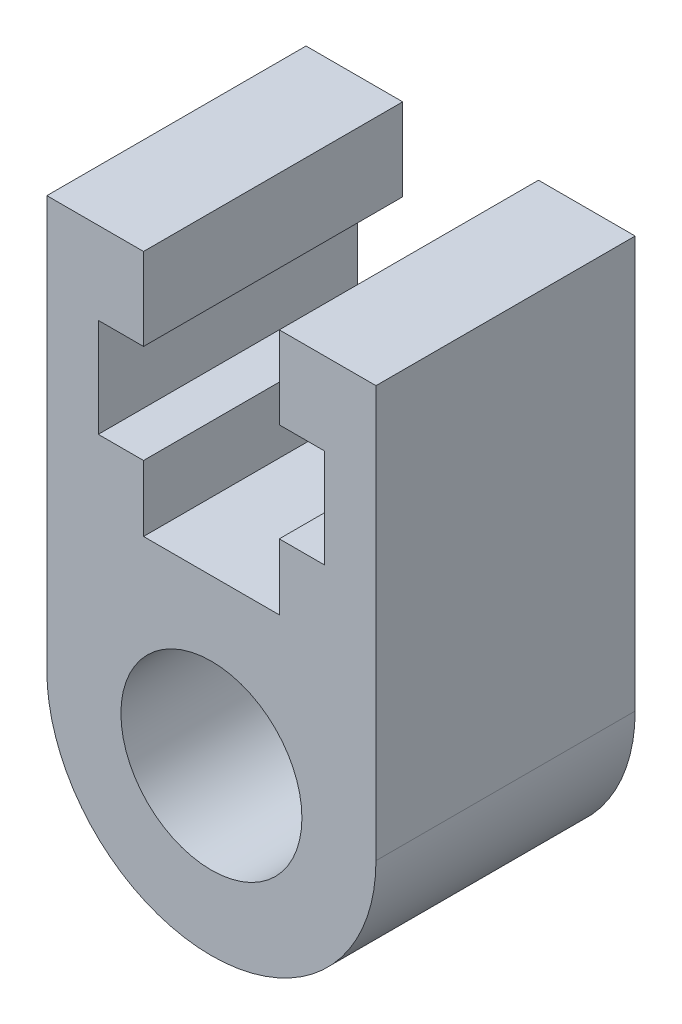
ISO-10303-21;
HEADER;
FILE_DESCRIPTION(('STEP AP214'),'2;1');
FILE_NAME('part.step','',(''),(''),'','','');
FILE_SCHEMA(('AUTOMOTIVE_DESIGN { 1 0 10303 214 1 1 1 1 }'));
ENDSEC;
DATA;
#1=APPLICATION_CONTEXT('core data for automotive mechanical design processes');
#2=APPLICATION_PROTOCOL_DEFINITION('international standard','automotive_design',2000,#1);
#3=PRODUCT_CONTEXT('',#1,'mechanical');
#4=PRODUCT('Part','Part','',(#3));
#5=PRODUCT_RELATED_PRODUCT_CATEGORY('part','',(#4));
#6=PRODUCT_DEFINITION_FORMATION('','',#4);
#7=PRODUCT_DEFINITION_CONTEXT('part definition',#1,'design');
#8=PRODUCT_DEFINITION('design','',#6,#7);
#9=PRODUCT_DEFINITION_SHAPE('','',#8);
#10=(LENGTH_UNIT() NAMED_UNIT(*) SI_UNIT(.MILLI.,.METRE.));
#11=(NAMED_UNIT(*) PLANE_ANGLE_UNIT() SI_UNIT($,.RADIAN.));
#12=(NAMED_UNIT(*) SI_UNIT($,.STERADIAN.) SOLID_ANGLE_UNIT());
#13=UNCERTAINTY_MEASURE_WITH_UNIT(LENGTH_MEASURE(1.E-05),#10,'distance_accuracy_value','');
#14=(GEOMETRIC_REPRESENTATION_CONTEXT(3) GLOBAL_UNCERTAINTY_ASSIGNED_CONTEXT((#13)) GLOBAL_UNIT_ASSIGNED_CONTEXT((#10,
#11,#12)) REPRESENTATION_CONTEXT('',''));
#15=CARTESIAN_POINT('',(0.,0.,0.));
#16=DIRECTION('',(0.,0.,1.));
#17=DIRECTION('',(1.,0.,0.));
#18=AXIS2_PLACEMENT_3D('',#15,#16,#17);
#19=CARTESIAN_POINT('',(0.,0.,6.3));
#20=DIRECTION('',(0.,0.,1.));
#21=DIRECTION('',(1.,0.,0.));
#22=AXIS2_PLACEMENT_3D('',#19,#20,#21);
#23=PLANE('',#22);
#24=CARTESIAN_POINT('',(0.,0.,6.3));
#25=DIRECTION('',(0.,0.,1.));
#26=DIRECTION('',(1.,0.,0.));
#27=AXIS2_PLACEMENT_3D('',#24,#25,#26);
#28=CIRCLE('',#27,4.);
#29=CARTESIAN_POINT('',(-4.,0.,6.3));
#30=VERTEX_POINT('',#29);
#31=CARTESIAN_POINT('',(4.,0.,6.3));
#32=VERTEX_POINT('',#31);
#33=EDGE_CURVE('E236',#30,#32,#28,.T.);
#34=ORIENTED_EDGE('',*,*,#33,.T.);
#35=DIRECTION('',(0.,1.,0.));
#36=VECTOR('',#35,1.);
#37=CARTESIAN_POINT('',(4.,0.,6.3));
#38=LINE('',#37,#36);
#39=CARTESIAN_POINT('',(4.,10.,6.3));
#40=VERTEX_POINT('',#39);
#41=EDGE_CURVE('E124',#32,#40,#38,.T.);
#42=ORIENTED_EDGE('',*,*,#41,.T.);
#43=DIRECTION('',(-1.,0.,0.));
#44=VECTOR('',#43,1.);
#45=CARTESIAN_POINT('',(4.,10.,6.3));
#46=LINE('',#45,#44);
#47=CARTESIAN_POINT('',(1.65,10.,6.3));
#48=VERTEX_POINT('',#47);
#49=EDGE_CURVE('E289',#40,#48,#46,.T.);
#50=ORIENTED_EDGE('',*,*,#49,.T.);
#51=DIRECTION('',(0.,-1.,0.));
#52=VECTOR('',#51,1.);
#53=CARTESIAN_POINT('',(1.65,10.,6.3));
#54=LINE('',#53,#52);
#55=CARTESIAN_POINT('',(1.65,8.,6.3));
#56=VERTEX_POINT('',#55);
#57=EDGE_CURVE('E309',#48,#56,#54,.T.);
#58=ORIENTED_EDGE('',*,*,#57,.T.);
#59=DIRECTION('',(1.,0.,0.));
#60=VECTOR('',#59,1.);
#61=CARTESIAN_POINT('',(1.65,8.,6.3));
#62=LINE('',#61,#60);
#63=CARTESIAN_POINT('',(2.75,8.,6.3));
#64=VERTEX_POINT('',#63);
#65=EDGE_CURVE('E305',#56,#64,#62,.T.);
#66=ORIENTED_EDGE('',*,*,#65,.T.);
#67=DIRECTION('',(0.,-1.,0.));
#68=VECTOR('',#67,1.);
#69=CARTESIAN_POINT('',(2.75,8.,6.3));
#70=LINE('',#69,#68);
#71=CARTESIAN_POINT('',(2.75,5.6,6.3));
#72=VERTEX_POINT('',#71);
#73=EDGE_CURVE('E308',#64,#72,#70,.T.);
#74=ORIENTED_EDGE('',*,*,#73,.T.);
#75=DIRECTION('',(-1.,0.,0.));
#76=VECTOR('',#75,1.);
#77=CARTESIAN_POINT('',(2.75,5.6,6.3));
#78=LINE('',#77,#76);
#79=CARTESIAN_POINT('',(1.65,5.6,6.3));
#80=VERTEX_POINT('',#79);
#81=EDGE_CURVE('E313',#72,#80,#78,.T.);
#82=ORIENTED_EDGE('',*,*,#81,.T.);
#83=DIRECTION('',(0.,-1.,0.));
#84=VECTOR('',#83,1.);
#85=CARTESIAN_POINT('',(1.65,5.6,6.3));
#86=LINE('',#85,#84);
#87=CARTESIAN_POINT('',(1.65,4.,6.3));
#88=VERTEX_POINT('',#87);
#89=EDGE_CURVE('E320',#80,#88,#86,.T.);
#90=ORIENTED_EDGE('',*,*,#89,.T.);
#91=DIRECTION('',(-1.,0.,0.));
#92=VECTOR('',#91,1.);
#93=CARTESIAN_POINT('',(-1.65,4.,6.3));
#94=LINE('',#93,#92);
#95=CARTESIAN_POINT('',(-1.65,4.,6.3));
#96=VERTEX_POINT('',#95);
#97=EDGE_CURVE('E323',#88,#96,#94,.T.);
#98=ORIENTED_EDGE('',*,*,#97,.T.);
#99=DIRECTION('',(0.,1.,0.));
#100=VECTOR('',#99,1.);
#101=CARTESIAN_POINT('',(-1.65,5.6,6.3));
#102=LINE('',#101,#100);
#103=CARTESIAN_POINT('',(-1.65,5.6,6.3));
#104=VERTEX_POINT('',#103);
#105=EDGE_CURVE('E326',#96,#104,#102,.T.);
#106=ORIENTED_EDGE('',*,*,#105,.T.);
#107=DIRECTION('',(-1.,0.,0.));
#108=VECTOR('',#107,1.);
#109=CARTESIAN_POINT('',(-2.75,5.6,6.3));
#110=LINE('',#109,#108);
#111=CARTESIAN_POINT('',(-2.75,5.6,6.3));
#112=VERTEX_POINT('',#111);
#113=EDGE_CURVE('E329',#104,#112,#110,.T.);
#114=ORIENTED_EDGE('',*,*,#113,.T.);
#115=DIRECTION('',(0.,1.,0.));
#116=VECTOR('',#115,1.);
#117=CARTESIAN_POINT('',(-2.75,8.,6.3));
#118=LINE('',#117,#116);
#119=CARTESIAN_POINT('',(-2.75,8.,6.3));
#120=VERTEX_POINT('',#119);
#121=EDGE_CURVE('E332',#112,#120,#118,.T.);
#122=ORIENTED_EDGE('',*,*,#121,.T.);
#123=DIRECTION('',(1.,0.,0.));
#124=VECTOR('',#123,1.);
#125=CARTESIAN_POINT('',(-1.65,8.,6.3));
#126=LINE('',#125,#124);
#127=CARTESIAN_POINT('',(-1.65,8.,6.3));
#128=VERTEX_POINT('',#127);
#129=EDGE_CURVE('E167',#120,#128,#126,.T.);
#130=ORIENTED_EDGE('',*,*,#129,.T.);
#131=DIRECTION('',(0.,1.,0.));
#132=VECTOR('',#131,1.);
#133=CARTESIAN_POINT('',(-1.65,10.,6.3));
#134=LINE('',#133,#132);
#135=CARTESIAN_POINT('',(-1.65,10.,6.3));
#136=VERTEX_POINT('',#135);
#137=EDGE_CURVE('E161',#128,#136,#134,.T.);
#138=ORIENTED_EDGE('',*,*,#137,.T.);
#139=DIRECTION('',(-1.,0.,0.));
#140=VECTOR('',#139,1.);
#141=CARTESIAN_POINT('',(-4.,10.,6.3));
#142=LINE('',#141,#140);
#143=CARTESIAN_POINT('',(-4.,10.,6.3));
#144=VERTEX_POINT('',#143);
#145=EDGE_CURVE('E165',#136,#144,#142,.T.);
#146=ORIENTED_EDGE('',*,*,#145,.T.);
#147=DIRECTION('',(0.,-1.,0.));
#148=VECTOR('',#147,1.);
#149=CARTESIAN_POINT('',(-4.,0.,6.3));
#150=LINE('',#149,#148);
#151=EDGE_CURVE('E57',#144,#30,#150,.T.);
#152=ORIENTED_EDGE('',*,*,#151,.T.);
#153=EDGE_LOOP('',(#34,#42,#50,#58,#66,#74,#82,#90,#98,#106,#114,#122,#130,#138,#146,#152));
#154=FACE_BOUND('',#153,.T.);
#155=CARTESIAN_POINT('',(0.,0.,6.3));
#156=DIRECTION('',(0.,0.,1.));
#157=DIRECTION('',(1.,0.,0.));
#158=AXIS2_PLACEMENT_3D('',#155,#156,#157);
#159=CIRCLE('',#158,2.2);
#160=CARTESIAN_POINT('',(2.2,0.,6.3));
#161=VERTEX_POINT('',#160);
#162=EDGE_CURVE('E194',#161,#161,#159,.T.);
#163=ORIENTED_EDGE('',*,*,#162,.F.);
#164=EDGE_LOOP('',(#163));
#165=FACE_BOUND('',#164,.T.);
#166=ADVANCED_FACE('F39',(#154,#165),#23,.T.);
#167=CARTESIAN_POINT('',(0.,0.,0.));
#168=DIRECTION('',(0.,0.,1.));
#169=DIRECTION('',(1.,0.,0.));
#170=AXIS2_PLACEMENT_3D('',#167,#168,#169);
#171=PLANE('',#170);
#172=CARTESIAN_POINT('',(0.,0.,0.));
#173=DIRECTION('',(0.,0.,1.));
#174=DIRECTION('',(1.,0.,0.));
#175=AXIS2_PLACEMENT_3D('',#172,#173,#174);
#176=CIRCLE('',#175,4.);
#177=CARTESIAN_POINT('',(-4.,0.,0.));
#178=VERTEX_POINT('',#177);
#179=CARTESIAN_POINT('',(4.,0.,0.));
#180=VERTEX_POINT('',#179);
#181=EDGE_CURVE('E189',#178,#180,#176,.T.);
#182=ORIENTED_EDGE('',*,*,#181,.F.);
#183=DIRECTION('',(0.,-1.,0.));
#184=VECTOR('',#183,1.);
#185=CARTESIAN_POINT('',(-4.,0.,0.));
#186=LINE('',#185,#184);
#187=CARTESIAN_POINT('',(-4.,10.,0.));
#188=VERTEX_POINT('',#187);
#189=EDGE_CURVE('E116',#188,#178,#186,.T.);
#190=ORIENTED_EDGE('',*,*,#189,.F.);
#191=DIRECTION('',(-1.,0.,0.));
#192=VECTOR('',#191,1.);
#193=CARTESIAN_POINT('',(-4.,10.,0.));
#194=LINE('',#193,#192);
#195=CARTESIAN_POINT('',(-1.65,10.,0.));
#196=VERTEX_POINT('',#195);
#197=EDGE_CURVE('E110',#196,#188,#194,.T.);
#198=ORIENTED_EDGE('',*,*,#197,.F.);
#199=DIRECTION('',(0.,1.,0.));
#200=VECTOR('',#199,1.);
#201=CARTESIAN_POINT('',(-1.65,10.,0.));
#202=LINE('',#201,#200);
#203=CARTESIAN_POINT('',(-1.65,8.,0.));
#204=VERTEX_POINT('',#203);
#205=EDGE_CURVE('E176',#204,#196,#202,.T.);
#206=ORIENTED_EDGE('',*,*,#205,.F.);
#207=DIRECTION('',(1.,0.,0.));
#208=VECTOR('',#207,1.);
#209=CARTESIAN_POINT('',(-1.65,8.,0.));
#210=LINE('',#209,#208);
#211=CARTESIAN_POINT('',(-2.75,8.,0.));
#212=VERTEX_POINT('',#211);
#213=EDGE_CURVE('E227',#212,#204,#210,.T.);
#214=ORIENTED_EDGE('',*,*,#213,.F.);
#215=DIRECTION('',(0.,1.,0.));
#216=VECTOR('',#215,1.);
#217=CARTESIAN_POINT('',(-2.75,8.,0.));
#218=LINE('',#217,#216);
#219=CARTESIAN_POINT('',(-2.75,5.6,0.));
#220=VERTEX_POINT('',#219);
#221=EDGE_CURVE('E224',#220,#212,#218,.T.);
#222=ORIENTED_EDGE('',*,*,#221,.F.);
#223=DIRECTION('',(-1.,0.,0.));
#224=VECTOR('',#223,1.);
#225=CARTESIAN_POINT('',(-2.75,5.6,0.));
#226=LINE('',#225,#224);
#227=CARTESIAN_POINT('',(-1.65,5.6,0.));
#228=VERTEX_POINT('',#227);
#229=EDGE_CURVE('E221',#228,#220,#226,.T.);
#230=ORIENTED_EDGE('',*,*,#229,.F.);
#231=DIRECTION('',(0.,1.,0.));
#232=VECTOR('',#231,1.);
#233=CARTESIAN_POINT('',(-1.65,5.6,0.));
#234=LINE('',#233,#232);
#235=CARTESIAN_POINT('',(-1.65,4.,0.));
#236=VERTEX_POINT('',#235);
#237=EDGE_CURVE('E218',#236,#228,#234,.T.);
#238=ORIENTED_EDGE('',*,*,#237,.F.);
#239=DIRECTION('',(-1.,0.,0.));
#240=VECTOR('',#239,1.);
#241=CARTESIAN_POINT('',(-1.65,4.,0.));
#242=LINE('',#241,#240);
#243=CARTESIAN_POINT('',(1.65,4.,0.));
#244=VERTEX_POINT('',#243);
#245=EDGE_CURVE('E215',#244,#236,#242,.T.);
#246=ORIENTED_EDGE('',*,*,#245,.F.);
#247=DIRECTION('',(0.,-1.,0.));
#248=VECTOR('',#247,1.);
#249=CARTESIAN_POINT('',(1.65,5.6,0.));
#250=LINE('',#249,#248);
#251=CARTESIAN_POINT('',(1.65,5.6,0.));
#252=VERTEX_POINT('',#251);
#253=EDGE_CURVE('E212',#252,#244,#250,.T.);
#254=ORIENTED_EDGE('',*,*,#253,.F.);
#255=DIRECTION('',(-1.,0.,0.));
#256=VECTOR('',#255,1.);
#257=CARTESIAN_POINT('',(2.75,5.6,0.));
#258=LINE('',#257,#256);
#259=CARTESIAN_POINT('',(2.75,5.6,0.));
#260=VERTEX_POINT('',#259);
#261=EDGE_CURVE('E209',#260,#252,#258,.T.);
#262=ORIENTED_EDGE('',*,*,#261,.F.);
#263=DIRECTION('',(0.,-1.,0.));
#264=VECTOR('',#263,1.);
#265=CARTESIAN_POINT('',(2.75,8.,0.));
#266=LINE('',#265,#264);
#267=CARTESIAN_POINT('',(2.75,8.,0.));
#268=VERTEX_POINT('',#267);
#269=EDGE_CURVE('E206',#268,#260,#266,.T.);
#270=ORIENTED_EDGE('',*,*,#269,.F.);
#271=DIRECTION('',(1.,0.,0.));
#272=VECTOR('',#271,1.);
#273=CARTESIAN_POINT('',(1.65,8.,0.));
#274=LINE('',#273,#272);
#275=CARTESIAN_POINT('',(1.65,8.,0.));
#276=VERTEX_POINT('',#275);
#277=EDGE_CURVE('E203',#276,#268,#274,.T.);
#278=ORIENTED_EDGE('',*,*,#277,.F.);
#279=DIRECTION('',(0.,-1.,0.));
#280=VECTOR('',#279,1.);
#281=CARTESIAN_POINT('',(1.65,10.,0.));
#282=LINE('',#281,#280);
#283=CARTESIAN_POINT('',(1.65,10.,0.));
#284=VERTEX_POINT('',#283);
#285=EDGE_CURVE('E200',#284,#276,#282,.T.);
#286=ORIENTED_EDGE('',*,*,#285,.F.);
#287=DIRECTION('',(-1.,0.,0.));
#288=VECTOR('',#287,1.);
#289=CARTESIAN_POINT('',(4.,10.,0.));
#290=LINE('',#289,#288);
#291=CARTESIAN_POINT('',(4.,10.,0.));
#292=VERTEX_POINT('',#291);
#293=EDGE_CURVE('E197',#292,#284,#290,.T.);
#294=ORIENTED_EDGE('',*,*,#293,.F.);
#295=DIRECTION('',(0.,1.,0.));
#296=VECTOR('',#295,1.);
#297=CARTESIAN_POINT('',(4.,0.,0.));
#298=LINE('',#297,#296);
#299=EDGE_CURVE('E193',#180,#292,#298,.T.);
#300=ORIENTED_EDGE('',*,*,#299,.F.);
#301=EDGE_LOOP('',(#182,#190,#198,#206,#214,#222,#230,#238,#246,#254,#262,#270,#278,#286,#294,#300));
#302=FACE_BOUND('',#301,.T.);
#303=CARTESIAN_POINT('',(0.,0.,0.));
#304=DIRECTION('',(0.,0.,1.));
#305=DIRECTION('',(1.,0.,0.));
#306=AXIS2_PLACEMENT_3D('',#303,#304,#305);
#307=CIRCLE('',#306,2.2);
#308=CARTESIAN_POINT('',(2.2,0.,0.));
#309=VERTEX_POINT('',#308);
#310=EDGE_CURVE('E533',#309,#309,#307,.T.);
#311=ORIENTED_EDGE('',*,*,#310,.T.);
#312=EDGE_LOOP('',(#311));
#313=FACE_BOUND('',#312,.T.);
#314=ADVANCED_FACE('F293',(#302,#313),#171,.F.);
#315=CARTESIAN_POINT('',(0.,0.,6.3));
#316=DIRECTION('',(0.,0.,-1.));
#317=DIRECTION('',(-1.,0.,0.));
#318=AXIS2_PLACEMENT_3D('',#315,#316,#317);
#319=CYLINDRICAL_SURFACE('',#318,4.);
#320=ORIENTED_EDGE('',*,*,#181,.T.);
#321=DIRECTION('',(0.,0.,-1.));
#322=VECTOR('',#321,1.);
#323=CARTESIAN_POINT('',(4.,0.,6.3));
#324=LINE('',#323,#322);
#325=EDGE_CURVE('E11',#32,#180,#324,.T.);
#326=ORIENTED_EDGE('',*,*,#325,.F.);
#327=ORIENTED_EDGE('',*,*,#33,.F.);
#328=DIRECTION('',(0.,0.,-1.));
#329=VECTOR('',#328,1.);
#330=CARTESIAN_POINT('',(-4.,0.,6.3));
#331=LINE('',#330,#329);
#332=EDGE_CURVE('E185',#30,#178,#331,.T.);
#333=ORIENTED_EDGE('',*,*,#332,.T.);
#334=EDGE_LOOP('',(#320,#326,#327,#333));
#335=FACE_BOUND('',#334,.T.);
#336=ADVANCED_FACE('F41',(#335),#319,.T.);
#337=CARTESIAN_POINT('',(4.,0.,6.3));
#338=DIRECTION('',(-1.,0.,0.));
#339=DIRECTION('',(0.,0.,1.));
#340=AXIS2_PLACEMENT_3D('',#337,#338,#339);
#341=PLANE('',#340);
#342=ORIENTED_EDGE('',*,*,#299,.T.);
#343=DIRECTION('',(0.,0.,-1.));
#344=VECTOR('',#343,1.);
#345=CARTESIAN_POINT('',(4.,10.,6.3));
#346=LINE('',#345,#344);
#347=EDGE_CURVE('E49',#40,#292,#346,.T.);
#348=ORIENTED_EDGE('',*,*,#347,.F.);
#349=ORIENTED_EDGE('',*,*,#41,.F.);
#350=ORIENTED_EDGE('',*,*,#325,.T.);
#351=EDGE_LOOP('',(#342,#348,#349,#350));
#352=FACE_BOUND('',#351,.T.);
#353=ADVANCED_FACE('F368',(#352),#341,.F.);
#354=CARTESIAN_POINT('',(4.,10.,6.3));
#355=DIRECTION('',(0.,-1.,0.));
#356=DIRECTION('',(0.,0.,-1.));
#357=AXIS2_PLACEMENT_3D('',#354,#355,#356);
#358=PLANE('',#357);
#359=ORIENTED_EDGE('',*,*,#293,.T.);
#360=DIRECTION('',(0.,0.,-1.));
#361=VECTOR('',#360,1.);
#362=CARTESIAN_POINT('',(1.65,10.,6.3));
#363=LINE('',#362,#361);
#364=EDGE_CURVE('E279',#48,#284,#363,.T.);
#365=ORIENTED_EDGE('',*,*,#364,.F.);
#366=ORIENTED_EDGE('',*,*,#49,.F.);
#367=ORIENTED_EDGE('',*,*,#347,.T.);
#368=EDGE_LOOP('',(#359,#365,#366,#367));
#369=FACE_BOUND('',#368,.T.);
#370=ADVANCED_FACE('F287',(#369),#358,.F.);
#371=CARTESIAN_POINT('',(1.65,10.,6.3));
#372=DIRECTION('',(1.,0.,0.));
#373=DIRECTION('',(0.,1.,0.));
#374=AXIS2_PLACEMENT_3D('',#371,#372,#373);
#375=PLANE('',#374);
#376=ORIENTED_EDGE('',*,*,#285,.T.);
#377=DIRECTION('',(0.,0.,-1.));
#378=VECTOR('',#377,1.);
#379=CARTESIAN_POINT('',(1.65,8.,6.3));
#380=LINE('',#379,#378);
#381=EDGE_CURVE('E275',#56,#276,#380,.T.);
#382=ORIENTED_EDGE('',*,*,#381,.F.);
#383=ORIENTED_EDGE('',*,*,#57,.F.);
#384=ORIENTED_EDGE('',*,*,#364,.T.);
#385=EDGE_LOOP('',(#376,#382,#383,#384));
#386=FACE_BOUND('',#385,.T.);
#387=ADVANCED_FACE('F299',(#386),#375,.F.);
#388=CARTESIAN_POINT('',(1.65,8.,6.3));
#389=DIRECTION('',(0.,1.,0.));
#390=DIRECTION('',(0.,0.,1.));
#391=AXIS2_PLACEMENT_3D('',#388,#389,#390);
#392=PLANE('',#391);
#393=ORIENTED_EDGE('',*,*,#277,.T.);
#394=DIRECTION('',(0.,0.,-1.));
#395=VECTOR('',#394,1.);
#396=CARTESIAN_POINT('',(2.75,8.,6.3));
#397=LINE('',#396,#395);
#398=EDGE_CURVE('E271',#64,#268,#397,.T.);
#399=ORIENTED_EDGE('',*,*,#398,.F.);
#400=ORIENTED_EDGE('',*,*,#65,.F.);
#401=ORIENTED_EDGE('',*,*,#381,.T.);
#402=EDGE_LOOP('',(#393,#399,#400,#401));
#403=FACE_BOUND('',#402,.T.);
#404=ADVANCED_FACE('F303',(#403),#392,.F.);
#405=CARTESIAN_POINT('',(2.75,8.,6.3));
#406=DIRECTION('',(1.,0.,0.));
#407=DIRECTION('',(0.,0.,-1.));
#408=AXIS2_PLACEMENT_3D('',#405,#406,#407);
#409=PLANE('',#408);
#410=ORIENTED_EDGE('',*,*,#269,.T.);
#411=DIRECTION('',(0.,0.,-1.));
#412=VECTOR('',#411,1.);
#413=CARTESIAN_POINT('',(2.75,5.6,6.3));
#414=LINE('',#413,#412);
#415=EDGE_CURVE('E267',#72,#260,#414,.T.);
#416=ORIENTED_EDGE('',*,*,#415,.F.);
#417=ORIENTED_EDGE('',*,*,#73,.F.);
#418=ORIENTED_EDGE('',*,*,#398,.T.);
#419=EDGE_LOOP('',(#410,#416,#417,#418));
#420=FACE_BOUND('',#419,.T.);
#421=ADVANCED_FACE('F381',(#420),#409,.F.);
#422=CARTESIAN_POINT('',(2.75,5.6,6.3));
#423=DIRECTION('',(0.,-1.,0.));
#424=DIRECTION('',(1.,0.,0.));
#425=AXIS2_PLACEMENT_3D('',#422,#423,#424);
#426=PLANE('',#425);
#427=ORIENTED_EDGE('',*,*,#261,.T.);
#428=DIRECTION('',(0.,0.,-1.));
#429=VECTOR('',#428,1.);
#430=CARTESIAN_POINT('',(1.65,5.6,6.3));
#431=LINE('',#430,#429);
#432=EDGE_CURVE('E263',#80,#252,#431,.T.);
#433=ORIENTED_EDGE('',*,*,#432,.F.);
#434=ORIENTED_EDGE('',*,*,#81,.F.);
#435=ORIENTED_EDGE('',*,*,#415,.T.);
#436=EDGE_LOOP('',(#427,#433,#434,#435));
#437=FACE_BOUND('',#436,.T.);
#438=ADVANCED_FACE('F384',(#437),#426,.F.);
#439=CARTESIAN_POINT('',(1.65,5.6,6.3));
#440=DIRECTION('',(1.,0.,0.));
#441=DIRECTION('',(0.,1.,0.));
#442=AXIS2_PLACEMENT_3D('',#439,#440,#441);
#443=PLANE('',#442);
#444=ORIENTED_EDGE('',*,*,#253,.T.);
#445=DIRECTION('',(0.,0.,-1.));
#446=VECTOR('',#445,1.);
#447=CARTESIAN_POINT('',(1.65,4.,6.3));
#448=LINE('',#447,#446);
#449=EDGE_CURVE('E259',#88,#244,#448,.T.);
#450=ORIENTED_EDGE('',*,*,#449,.F.);
#451=ORIENTED_EDGE('',*,*,#89,.F.);
#452=ORIENTED_EDGE('',*,*,#432,.T.);
#453=EDGE_LOOP('',(#444,#450,#451,#452));
#454=FACE_BOUND('',#453,.T.);
#455=ADVANCED_FACE('F388',(#454),#443,.F.);
#456=CARTESIAN_POINT('',(-1.65,4.,6.3));
#457=DIRECTION('',(0.,-1.,0.));
#458=DIRECTION('',(0.,0.,-1.));
#459=AXIS2_PLACEMENT_3D('',#456,#457,#458);
#460=PLANE('',#459);
#461=ORIENTED_EDGE('',*,*,#245,.T.);
#462=DIRECTION('',(0.,0.,-1.));
#463=VECTOR('',#462,1.);
#464=CARTESIAN_POINT('',(-1.65,4.,6.3));
#465=LINE('',#464,#463);
#466=EDGE_CURVE('E255',#96,#236,#465,.T.);
#467=ORIENTED_EDGE('',*,*,#466,.F.);
#468=ORIENTED_EDGE('',*,*,#97,.F.);
#469=ORIENTED_EDGE('',*,*,#449,.T.);
#470=EDGE_LOOP('',(#461,#467,#468,#469));
#471=FACE_BOUND('',#470,.T.);
#472=ADVANCED_FACE('F392',(#471),#460,.F.);
#473=CARTESIAN_POINT('',(-1.65,5.6,6.3));
#474=DIRECTION('',(-1.,0.,0.));
#475=DIRECTION('',(0.,-1.,0.));
#476=AXIS2_PLACEMENT_3D('',#473,#474,#475);
#477=PLANE('',#476);
#478=ORIENTED_EDGE('',*,*,#237,.T.);
#479=DIRECTION('',(0.,0.,-1.));
#480=VECTOR('',#479,1.);
#481=CARTESIAN_POINT('',(-1.65,5.6,6.3));
#482=LINE('',#481,#480);
#483=EDGE_CURVE('E251',#104,#228,#482,.T.);
#484=ORIENTED_EDGE('',*,*,#483,.F.);
#485=ORIENTED_EDGE('',*,*,#105,.F.);
#486=ORIENTED_EDGE('',*,*,#466,.T.);
#487=EDGE_LOOP('',(#478,#484,#485,#486));
#488=FACE_BOUND('',#487,.T.);
#489=ADVANCED_FACE('F396',(#488),#477,.F.);
#490=CARTESIAN_POINT('',(-2.75,5.6,6.3));
#491=DIRECTION('',(0.,-1.,0.));
#492=DIRECTION('',(1.,0.,0.));
#493=AXIS2_PLACEMENT_3D('',#490,#491,#492);
#494=PLANE('',#493);
#495=ORIENTED_EDGE('',*,*,#229,.T.);
#496=DIRECTION('',(0.,0.,-1.));
#497=VECTOR('',#496,1.);
#498=CARTESIAN_POINT('',(-2.75,5.6,6.3));
#499=LINE('',#498,#497);
#500=EDGE_CURVE('E247',#112,#220,#499,.T.);
#501=ORIENTED_EDGE('',*,*,#500,.F.);
#502=ORIENTED_EDGE('',*,*,#113,.F.);
#503=ORIENTED_EDGE('',*,*,#483,.T.);
#504=EDGE_LOOP('',(#495,#501,#502,#503));
#505=FACE_BOUND('',#504,.T.);
#506=ADVANCED_FACE('F400',(#505),#494,.F.);
#507=CARTESIAN_POINT('',(-2.75,8.,6.3));
#508=DIRECTION('',(-1.,0.,0.));
#509=DIRECTION('',(0.,0.,1.));
#510=AXIS2_PLACEMENT_3D('',#507,#508,#509);
#511=PLANE('',#510);
#512=ORIENTED_EDGE('',*,*,#221,.T.);
#513=DIRECTION('',(0.,0.,-1.));
#514=VECTOR('',#513,1.);
#515=CARTESIAN_POINT('',(-2.75,8.,6.3));
#516=LINE('',#515,#514);
#517=EDGE_CURVE('E243',#120,#212,#516,.T.);
#518=ORIENTED_EDGE('',*,*,#517,.F.);
#519=ORIENTED_EDGE('',*,*,#121,.F.);
#520=ORIENTED_EDGE('',*,*,#500,.T.);
#521=EDGE_LOOP('',(#512,#518,#519,#520));
#522=FACE_BOUND('',#521,.T.);
#523=ADVANCED_FACE('F340',(#522),#511,.F.);
#524=CARTESIAN_POINT('',(-1.65,8.,6.3));
#525=DIRECTION('',(0.,1.,0.));
#526=DIRECTION('',(0.,0.,1.));
#527=AXIS2_PLACEMENT_3D('',#524,#525,#526);
#528=PLANE('',#527);
#529=ORIENTED_EDGE('',*,*,#213,.T.);
#530=DIRECTION('',(0.,0.,-1.));
#531=VECTOR('',#530,1.);
#532=CARTESIAN_POINT('',(-1.65,8.,6.3));
#533=LINE('',#532,#531);
#534=EDGE_CURVE('E178',#128,#204,#533,.T.);
#535=ORIENTED_EDGE('',*,*,#534,.F.);
#536=ORIENTED_EDGE('',*,*,#129,.F.);
#537=ORIENTED_EDGE('',*,*,#517,.T.);
#538=EDGE_LOOP('',(#529,#535,#536,#537));
#539=FACE_BOUND('',#538,.T.);
#540=ADVANCED_FACE('F344',(#539),#528,.F.);
#541=CARTESIAN_POINT('',(-1.65,10.,6.3));
#542=DIRECTION('',(-1.,0.,0.));
#543=DIRECTION('',(0.,-1.,0.));
#544=AXIS2_PLACEMENT_3D('',#541,#542,#543);
#545=PLANE('',#544);
#546=ORIENTED_EDGE('',*,*,#205,.T.);
#547=DIRECTION('',(0.,0.,-1.));
#548=VECTOR('',#547,1.);
#549=CARTESIAN_POINT('',(-1.65,10.,6.3));
#550=LINE('',#549,#548);
#551=EDGE_CURVE('E173',#136,#196,#550,.T.);
#552=ORIENTED_EDGE('',*,*,#551,.F.);
#553=ORIENTED_EDGE('',*,*,#137,.F.);
#554=ORIENTED_EDGE('',*,*,#534,.T.);
#555=EDGE_LOOP('',(#546,#552,#553,#554));
#556=FACE_BOUND('',#555,.T.);
#557=ADVANCED_FACE('F174',(#556),#545,.F.);
#558=CARTESIAN_POINT('',(-4.,10.,6.3));
#559=DIRECTION('',(0.,-1.,0.));
#560=DIRECTION('',(0.,0.,-1.));
#561=AXIS2_PLACEMENT_3D('',#558,#559,#560);
#562=PLANE('',#561);
#563=ORIENTED_EDGE('',*,*,#197,.T.);
#564=DIRECTION('',(0.,0.,-1.));
#565=VECTOR('',#564,1.);
#566=CARTESIAN_POINT('',(-4.,10.,6.3));
#567=LINE('',#566,#565);
#568=EDGE_CURVE('E179',#144,#188,#567,.T.);
#569=ORIENTED_EDGE('',*,*,#568,.F.);
#570=ORIENTED_EDGE('',*,*,#145,.F.);
#571=ORIENTED_EDGE('',*,*,#551,.T.);
#572=EDGE_LOOP('',(#563,#569,#570,#571));
#573=FACE_BOUND('',#572,.T.);
#574=ADVANCED_FACE('F181',(#573),#562,.F.);
#575=CARTESIAN_POINT('',(-4.,0.,6.3));
#576=DIRECTION('',(1.,0.,0.));
#577=DIRECTION('',(0.,0.,-1.));
#578=AXIS2_PLACEMENT_3D('',#575,#576,#577);
#579=PLANE('',#578);
#580=ORIENTED_EDGE('',*,*,#189,.T.);
#581=ORIENTED_EDGE('',*,*,#332,.F.);
#582=ORIENTED_EDGE('',*,*,#151,.F.);
#583=ORIENTED_EDGE('',*,*,#568,.T.);
#584=EDGE_LOOP('',(#580,#581,#582,#583));
#585=FACE_BOUND('',#584,.T.);
#586=ADVANCED_FACE('F348',(#585),#579,.F.);
#587=CARTESIAN_POINT('',(0.,0.,6.3));
#588=DIRECTION('',(0.,0.,-1.));
#589=DIRECTION('',(-1.,0.,0.));
#590=AXIS2_PLACEMENT_3D('',#587,#588,#589);
#591=CYLINDRICAL_SURFACE('',#590,2.2);
#592=ORIENTED_EDGE('',*,*,#162,.T.);
#593=EDGE_LOOP('',(#592));
#594=FACE_BOUND('',#593,.T.);
#595=ORIENTED_EDGE('',*,*,#310,.F.);
#596=EDGE_LOOP('',(#595));
#597=FACE_BOUND('',#596,.T.);
#598=ADVANCED_FACE('F350',(#594,#597),#591,.F.);
#599=CLOSED_SHELL('',(#166,#314,#336,#353,#370,#387,#404,#421,#438,#455,#472,#489,#506,#523,
#540,#557,#574,#586,#598));
#600=MANIFOLD_SOLID_BREP('B2',#599);
#601=ADVANCED_BREP_SHAPE_REPRESENTATION('',(#18,#600),#14);
#602=SHAPE_DEFINITION_REPRESENTATION(#9,#601);
ENDSEC;
END-ISO-10303-21;
